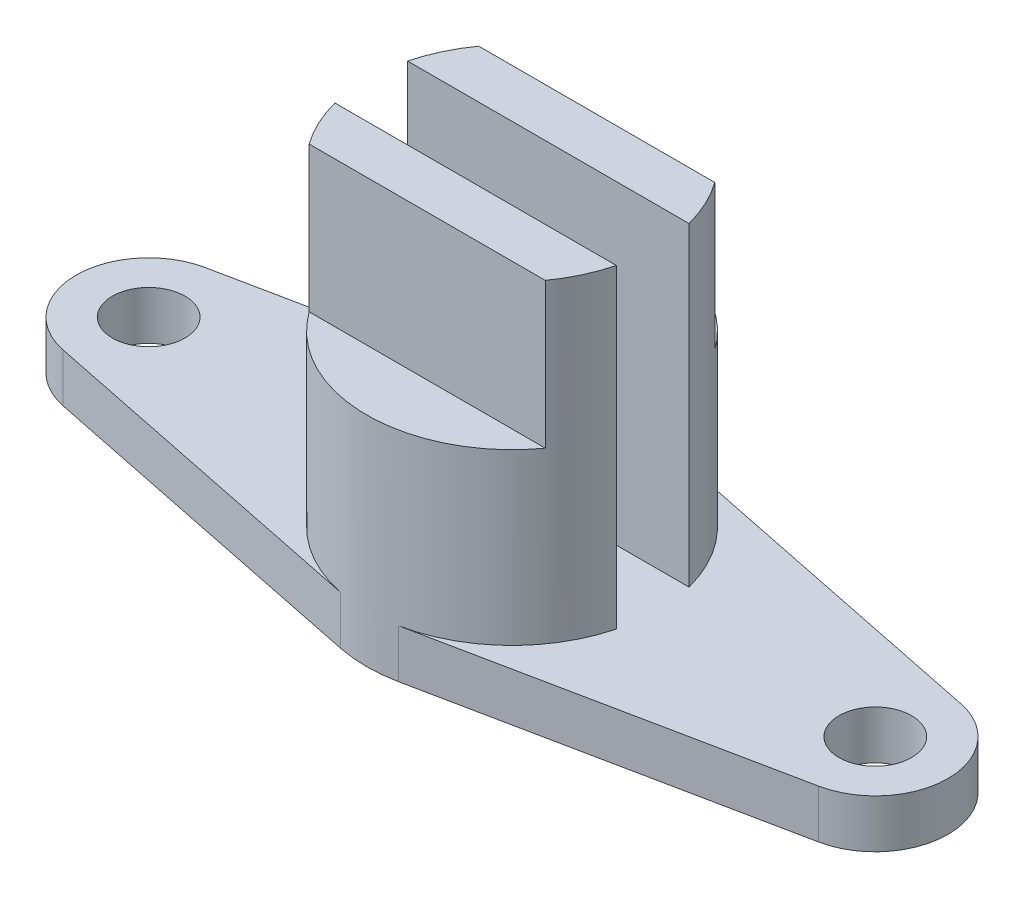
ISO-10303-21;
HEADER;
FILE_DESCRIPTION(('STEP AP214'),'2;1');
FILE_NAME('part.step','',(''),(''),'','','');
FILE_SCHEMA(('AUTOMOTIVE_DESIGN { 1 0 10303 214 1 1 1 1 }'));
ENDSEC;
DATA;
#1=APPLICATION_CONTEXT('core data for automotive mechanical design processes');
#2=APPLICATION_PROTOCOL_DEFINITION('international standard','automotive_design',2000,#1);
#3=PRODUCT_CONTEXT('',#1,'mechanical');
#4=PRODUCT('Part','Part','',(#3));
#5=PRODUCT_RELATED_PRODUCT_CATEGORY('part','',(#4));
#6=PRODUCT_DEFINITION_FORMATION('','',#4);
#7=PRODUCT_DEFINITION_CONTEXT('part definition',#1,'design');
#8=PRODUCT_DEFINITION('design','',#6,#7);
#9=PRODUCT_DEFINITION_SHAPE('','',#8);
#10=(LENGTH_UNIT() NAMED_UNIT(*) SI_UNIT(.MILLI.,.METRE.));
#11=(NAMED_UNIT(*) PLANE_ANGLE_UNIT() SI_UNIT($,.RADIAN.));
#12=(NAMED_UNIT(*) SI_UNIT($,.STERADIAN.) SOLID_ANGLE_UNIT());
#13=UNCERTAINTY_MEASURE_WITH_UNIT(LENGTH_MEASURE(1.E-05),#10,'distance_accuracy_value','');
#14=(GEOMETRIC_REPRESENTATION_CONTEXT(3) GLOBAL_UNCERTAINTY_ASSIGNED_CONTEXT((#13)) GLOBAL_UNIT_ASSIGNED_CONTEXT((#10,
#11,#12)) REPRESENTATION_CONTEXT('',''));
#15=CARTESIAN_POINT('',(0.,0.,0.));
#16=DIRECTION('',(0.,0.,1.));
#17=DIRECTION('',(1.,0.,0.));
#18=AXIS2_PLACEMENT_3D('',#15,#16,#17);
#19=CARTESIAN_POINT('',(0.,10.,0.));
#20=DIRECTION('',(0.,-1.,0.));
#21=DIRECTION('',(0.,0.,-1.));
#22=AXIS2_PLACEMENT_3D('',#19,#20,#21);
#23=CYLINDRICAL_SURFACE('',#22,30.);
#24=DIRECTION('',(0.,-1.,0.));
#25=VECTOR('',#24,1.);
#26=CARTESIAN_POINT('',(24.3669858620224,10.,-17.5));
#27=LINE('',#26,#25);
#28=CARTESIAN_POINT('',(24.3669858620224,75.,-17.5));
#29=VERTEX_POINT('',#28);
#30=CARTESIAN_POINT('',(24.3669858620224,45.,-17.5));
#31=VERTEX_POINT('',#30);
#32=EDGE_CURVE('E159',#29,#31,#27,.T.);
#33=ORIENTED_EDGE('',*,*,#32,.F.);
#34=CARTESIAN_POINT('',(0.,75.,0.));
#35=DIRECTION('',(0.,1.,0.));
#36=DIRECTION('',(0.,0.,1.));
#37=AXIS2_PLACEMENT_3D('',#34,#35,#36);
#38=CIRCLE('',#37,30.);
#39=CARTESIAN_POINT('',(29.0473750965556,75.,-7.5));
#40=VERTEX_POINT('',#39);
#41=EDGE_CURVE('E207',#40,#29,#38,.T.);
#42=ORIENTED_EDGE('',*,*,#41,.F.);
#43=DIRECTION('',(0.,-1.,0.));
#44=VECTOR('',#43,1.);
#45=CARTESIAN_POINT('',(29.0473750965556,10.,-7.49999999999999));
#46=LINE('',#45,#44);
#47=CARTESIAN_POINT('',(29.0473750965556,9.99999999999999,-7.49999999999999));
#48=VERTEX_POINT('',#47);
#49=EDGE_CURVE('E189',#40,#48,#46,.T.);
#50=ORIENTED_EDGE('',*,*,#49,.T.);
#51=CARTESIAN_POINT('',(0.,10.,0.));
#52=DIRECTION('',(0.,1.,0.));
#53=DIRECTION('',(0.,0.,1.));
#54=AXIS2_PLACEMENT_3D('',#51,#52,#53);
#55=CIRCLE('',#54,30.);
#56=CARTESIAN_POINT('',(6.,10.,-29.3938769133981));
#57=VERTEX_POINT('',#56);
#58=EDGE_CURVE('E201',#48,#57,#55,.T.);
#59=ORIENTED_EDGE('',*,*,#58,.T.);
#60=DIRECTION('',(0.,-1.,0.));
#61=VECTOR('',#60,1.);
#62=CARTESIAN_POINT('',(6.,10.,-29.3938769133981));
#63=LINE('',#62,#61);
#64=CARTESIAN_POINT('',(6.,0.,-29.3938769133981));
#65=VERTEX_POINT('',#64);
#66=EDGE_CURVE('E299',#57,#65,#63,.T.);
#67=ORIENTED_EDGE('',*,*,#66,.T.);
#68=CARTESIAN_POINT('',(0.,0.,0.));
#69=DIRECTION('',(0.,1.,0.));
#70=DIRECTION('',(0.,0.,1.));
#71=AXIS2_PLACEMENT_3D('',#68,#69,#70);
#72=CIRCLE('',#71,30.);
#73=CARTESIAN_POINT('',(-6.,0.,-29.3938769133981));
#74=VERTEX_POINT('',#73);
#75=EDGE_CURVE('E259',#65,#74,#72,.T.);
#76=ORIENTED_EDGE('',*,*,#75,.T.);
#77=DIRECTION('',(0.,-1.,0.));
#78=VECTOR('',#77,1.);
#79=CARTESIAN_POINT('',(-6.,10.,-29.3938769133981));
#80=LINE('',#79,#78);
#81=CARTESIAN_POINT('',(-6.,10.,-29.3938769133981));
#82=VERTEX_POINT('',#81);
#83=EDGE_CURVE('E295',#82,#74,#80,.T.);
#84=ORIENTED_EDGE('',*,*,#83,.F.);
#85=CARTESIAN_POINT('',(-29.0473750965556,9.99999999999999,-7.49999999999999));
#86=VERTEX_POINT('',#85);
#87=EDGE_CURVE('E213',#82,#86,#55,.T.);
#88=ORIENTED_EDGE('',*,*,#87,.T.);
#89=DIRECTION('',(0.,-1.,0.));
#90=VECTOR('',#89,1.);
#91=CARTESIAN_POINT('',(-29.0473750965556,10.,-7.49999999999999));
#92=LINE('',#91,#90);
#93=CARTESIAN_POINT('',(-29.0473750965556,75.,-7.5));
#94=VERTEX_POINT('',#93);
#95=EDGE_CURVE('E183',#86,#94,#92,.F.);
#96=ORIENTED_EDGE('',*,*,#95,.T.);
#97=CARTESIAN_POINT('',(-24.3669858620224,75.,-17.5));
#98=VERTEX_POINT('',#97);
#99=EDGE_CURVE('E164',#98,#94,#38,.T.);
#100=ORIENTED_EDGE('',*,*,#99,.F.);
#101=DIRECTION('',(0.,-1.,0.));
#102=VECTOR('',#101,1.);
#103=CARTESIAN_POINT('',(-24.3669858620224,10.,-17.5));
#104=LINE('',#103,#102);
#105=CARTESIAN_POINT('',(-24.3669858620224,45.,-17.5));
#106=VERTEX_POINT('',#105);
#107=EDGE_CURVE('E55',#106,#98,#104,.F.);
#108=ORIENTED_EDGE('',*,*,#107,.F.);
#109=CARTESIAN_POINT('',(0.,45.,0.));
#110=DIRECTION('',(0.,1.,0.));
#111=DIRECTION('',(0.,0.,1.));
#112=AXIS2_PLACEMENT_3D('',#109,#110,#111);
#113=CIRCLE('',#112,30.);
#114=EDGE_CURVE('E11',#31,#106,#113,.T.);
#115=ORIENTED_EDGE('',*,*,#114,.F.);
#116=EDGE_LOOP('',(#33,#42,#50,#59,#67,#76,#84,#88,#96,#100,#108,#115));
#117=FACE_BOUND('',#116,.T.);
#118=ADVANCED_FACE('F39',(#117),#23,.T.);
#119=CARTESIAN_POINT('',(0.,75.,0.));
#120=DIRECTION('',(0.,1.,0.));
#121=DIRECTION('',(0.,0.,1.));
#122=AXIS2_PLACEMENT_3D('',#119,#120,#121);
#123=PLANE('',#122);
#124=ORIENTED_EDGE('',*,*,#41,.T.);
#125=DIRECTION('',(-1.,0.,0.));
#126=VECTOR('',#125,1.);
#127=CARTESIAN_POINT('',(0.,75.,-17.5));
#128=LINE('',#127,#126);
#129=EDGE_CURVE('E48',#29,#98,#128,.T.);
#130=ORIENTED_EDGE('',*,*,#129,.T.);
#131=ORIENTED_EDGE('',*,*,#99,.T.);
#132=DIRECTION('',(-1.,0.,0.));
#133=VECTOR('',#132,1.);
#134=CARTESIAN_POINT('',(0.,75.,-7.5));
#135=LINE('',#134,#133);
#136=EDGE_CURVE('E307',#40,#94,#135,.T.);
#137=ORIENTED_EDGE('',*,*,#136,.F.);
#138=EDGE_LOOP('',(#124,#130,#131,#137));
#139=FACE_BOUND('',#138,.T.);
#140=ADVANCED_FACE('F324',(#139),#123,.T.);
#141=CARTESIAN_POINT('',(24.3669858620224,75.,17.5));
#142=VERTEX_POINT('',#141);
#143=CARTESIAN_POINT('',(29.0473750965556,75.,7.5));
#144=VERTEX_POINT('',#143);
#145=EDGE_CURVE('E206',#142,#144,#38,.T.);
#146=ORIENTED_EDGE('',*,*,#145,.F.);
#147=DIRECTION('',(0.,-1.,0.));
#148=VECTOR('',#147,1.);
#149=CARTESIAN_POINT('',(24.3669858620224,10.,17.5));
#150=LINE('',#149,#148);
#151=CARTESIAN_POINT('',(24.3669858620224,45.,17.5));
#152=VERTEX_POINT('',#151);
#153=EDGE_CURVE('E63',#142,#152,#150,.T.);
#154=ORIENTED_EDGE('',*,*,#153,.T.);
#155=CARTESIAN_POINT('',(0.,45.,0.));
#156=DIRECTION('',(0.,-1.,0.));
#157=DIRECTION('',(0.,0.,-1.));
#158=AXIS2_PLACEMENT_3D('',#155,#156,#157);
#159=CIRCLE('',#158,30.);
#160=CARTESIAN_POINT('',(-24.3669858620224,45.,17.5));
#161=VERTEX_POINT('',#160);
#162=EDGE_CURVE('E318',#152,#161,#159,.T.);
#163=ORIENTED_EDGE('',*,*,#162,.T.);
#164=DIRECTION('',(0.,-1.,0.));
#165=VECTOR('',#164,1.);
#166=CARTESIAN_POINT('',(-24.3669858620224,10.,17.5));
#167=LINE('',#166,#165);
#168=CARTESIAN_POINT('',(-24.3669858620224,75.,17.5));
#169=VERTEX_POINT('',#168);
#170=EDGE_CURVE('E173',#161,#169,#167,.F.);
#171=ORIENTED_EDGE('',*,*,#170,.T.);
#172=CARTESIAN_POINT('',(-29.0473750965556,75.,7.5));
#173=VERTEX_POINT('',#172);
#174=EDGE_CURVE('E202',#173,#169,#38,.T.);
#175=ORIENTED_EDGE('',*,*,#174,.F.);
#176=DIRECTION('',(0.,-1.,0.));
#177=VECTOR('',#176,1.);
#178=CARTESIAN_POINT('',(-29.0473750965556,10.,7.49999999999999));
#179=LINE('',#178,#177);
#180=CARTESIAN_POINT('',(-29.0473750965556,9.99999999999999,7.49999999999999));
#181=VERTEX_POINT('',#180);
#182=EDGE_CURVE('E197',#173,#181,#179,.T.);
#183=ORIENTED_EDGE('',*,*,#182,.T.);
#184=CARTESIAN_POINT('',(-5.99999999999999,10.,29.3938769133981));
#185=VERTEX_POINT('',#184);
#186=EDGE_CURVE('E212',#181,#185,#55,.T.);
#187=ORIENTED_EDGE('',*,*,#186,.T.);
#188=DIRECTION('',(0.,-1.,0.));
#189=VECTOR('',#188,1.);
#190=CARTESIAN_POINT('',(-5.99999999999999,10.,29.3938769133981));
#191=LINE('',#190,#189);
#192=CARTESIAN_POINT('',(-5.99999999999999,0.,29.3938769133981));
#193=VERTEX_POINT('',#192);
#194=EDGE_CURVE('E283',#185,#193,#191,.T.);
#195=ORIENTED_EDGE('',*,*,#194,.T.);
#196=CARTESIAN_POINT('',(0.,0.,0.));
#197=DIRECTION('',(0.,1.,0.));
#198=DIRECTION('',(0.,0.,1.));
#199=AXIS2_PLACEMENT_3D('',#196,#197,#198);
#200=CIRCLE('',#199,30.);
#201=CARTESIAN_POINT('',(6.,0.,29.3938769133981));
#202=VERTEX_POINT('',#201);
#203=EDGE_CURVE('E271',#193,#202,#200,.T.);
#204=ORIENTED_EDGE('',*,*,#203,.T.);
#205=DIRECTION('',(0.,-1.,0.));
#206=VECTOR('',#205,1.);
#207=CARTESIAN_POINT('',(6.,10.,29.3938769133981));
#208=LINE('',#207,#206);
#209=CARTESIAN_POINT('',(6.,10.,29.3938769133981));
#210=VERTEX_POINT('',#209);
#211=EDGE_CURVE('E279',#210,#202,#208,.T.);
#212=ORIENTED_EDGE('',*,*,#211,.F.);
#213=CARTESIAN_POINT('',(29.0473750965556,9.99999999999999,7.49999999999999));
#214=VERTEX_POINT('',#213);
#215=EDGE_CURVE('E208',#210,#214,#55,.T.);
#216=ORIENTED_EDGE('',*,*,#215,.T.);
#217=DIRECTION('',(0.,-1.,0.));
#218=VECTOR('',#217,1.);
#219=CARTESIAN_POINT('',(29.0473750965556,10.,7.49999999999999));
#220=LINE('',#219,#218);
#221=EDGE_CURVE('E193',#214,#144,#220,.F.);
#222=ORIENTED_EDGE('',*,*,#221,.T.);
#223=EDGE_LOOP('',(#146,#154,#163,#171,#175,#183,#187,#195,#204,#212,#216,#222));
#224=FACE_BOUND('',#223,.T.);
#225=ADVANCED_FACE('F339',(#224),#23,.T.);
#226=DIRECTION('',(-1.,0.,0.));
#227=VECTOR('',#226,1.);
#228=CARTESIAN_POINT('',(0.,75.,17.5));
#229=LINE('',#228,#227);
#230=EDGE_CURVE('E315',#142,#169,#229,.T.);
#231=ORIENTED_EDGE('',*,*,#230,.F.);
#232=ORIENTED_EDGE('',*,*,#145,.T.);
#233=DIRECTION('',(1.,0.,0.));
#234=VECTOR('',#233,1.);
#235=CARTESIAN_POINT('',(0.,75.,7.5));
#236=LINE('',#235,#234);
#237=EDGE_CURVE('E311',#173,#144,#236,.T.);
#238=ORIENTED_EDGE('',*,*,#237,.F.);
#239=ORIENTED_EDGE('',*,*,#174,.T.);
#240=EDGE_LOOP('',(#231,#232,#238,#239));
#241=FACE_BOUND('',#240,.T.);
#242=ADVANCED_FACE('F334',(#241),#123,.T.);
#243=CARTESIAN_POINT('',(75.,10.,0.));
#244=DIRECTION('',(0.,-1.,0.));
#245=DIRECTION('',(0.,0.,-1.));
#246=AXIS2_PLACEMENT_3D('',#243,#244,#245);
#247=PLANE('',#246);
#248=CARTESIAN_POINT('',(75.,10.,0.));
#249=DIRECTION('',(0.,1.,0.));
#250=DIRECTION('',(0.,0.,1.));
#251=AXIS2_PLACEMENT_3D('',#248,#249,#250);
#252=CIRCLE('',#251,7.5);
#253=CARTESIAN_POINT('',(75.,10.,7.5));
#254=VERTEX_POINT('',#253);
#255=EDGE_CURVE('E214',#254,#254,#252,.T.);
#256=ORIENTED_EDGE('',*,*,#255,.F.);
#257=EDGE_LOOP('',(#256));
#258=FACE_BOUND('',#257,.T.);
#259=CARTESIAN_POINT('',(-75.,10.,0.));
#260=DIRECTION('',(0.,1.,0.));
#261=DIRECTION('',(0.,0.,1.));
#262=AXIS2_PLACEMENT_3D('',#259,#260,#261);
#263=CIRCLE('',#262,7.5);
#264=CARTESIAN_POINT('',(-75.,10.,7.50000000000002));
#265=VERTEX_POINT('',#264);
#266=EDGE_CURVE('E223',#265,#265,#263,.T.);
#267=ORIENTED_EDGE('',*,*,#266,.F.);
#268=EDGE_LOOP('',(#267));
#269=FACE_BOUND('',#268,.T.);
#270=CARTESIAN_POINT('',(-75.,10.,0.));
#271=DIRECTION('',(0.,1.,0.));
#272=DIRECTION('',(0.,0.,1.));
#273=AXIS2_PLACEMENT_3D('',#270,#271,#272);
#274=CIRCLE('',#273,15.);
#275=CARTESIAN_POINT('',(-78.,10.,-14.696938456699));
#276=VERTEX_POINT('',#275);
#277=CARTESIAN_POINT('',(-78.,10.,14.6969384566991));
#278=VERTEX_POINT('',#277);
#279=EDGE_CURVE('E242',#276,#278,#274,.T.);
#280=ORIENTED_EDGE('',*,*,#279,.T.);
#281=DIRECTION('',(0.979795897113271,0.,0.2));
#282=VECTOR('',#281,1.);
#283=CARTESIAN_POINT('',(-5.99999999999999,10.,29.3938769133981));
#284=LINE('',#283,#282);
#285=EDGE_CURVE('E245',#278,#185,#284,.T.);
#286=ORIENTED_EDGE('',*,*,#285,.T.);
#287=ORIENTED_EDGE('',*,*,#186,.F.);
#288=DIRECTION('',(1.,0.,0.));
#289=VECTOR('',#288,1.);
#290=CARTESIAN_POINT('',(-90.,9.99999999999999,7.49999999999999));
#291=LINE('',#290,#289);
#292=EDGE_CURVE('E179',#181,#214,#291,.T.);
#293=ORIENTED_EDGE('',*,*,#292,.T.);
#294=ORIENTED_EDGE('',*,*,#215,.F.);
#295=DIRECTION('',(0.979795897113271,0.,-0.2));
#296=VECTOR('',#295,1.);
#297=CARTESIAN_POINT('',(6.,10.,29.3938769133981));
#298=LINE('',#297,#296);
#299=CARTESIAN_POINT('',(78.,10.,14.6969384566991));
#300=VERTEX_POINT('',#299);
#301=EDGE_CURVE('E249',#210,#300,#298,.T.);
#302=ORIENTED_EDGE('',*,*,#301,.T.);
#303=CARTESIAN_POINT('',(75.,10.,0.));
#304=DIRECTION('',(0.,1.,0.));
#305=DIRECTION('',(0.,0.,-1.));
#306=AXIS2_PLACEMENT_3D('',#303,#304,#305);
#307=CIRCLE('',#306,15.);
#308=CARTESIAN_POINT('',(78.,10.,-14.6969384566991));
#309=VERTEX_POINT('',#308);
#310=EDGE_CURVE('E231',#300,#309,#307,.T.);
#311=ORIENTED_EDGE('',*,*,#310,.T.);
#312=DIRECTION('',(-0.979795897113271,0.,-0.2));
#313=VECTOR('',#312,1.);
#314=CARTESIAN_POINT('',(6.,10.,-29.3938769133981));
#315=LINE('',#314,#313);
#316=EDGE_CURVE('E234',#309,#57,#315,.T.);
#317=ORIENTED_EDGE('',*,*,#316,.T.);
#318=ORIENTED_EDGE('',*,*,#58,.F.);
#319=DIRECTION('',(1.,0.,0.));
#320=VECTOR('',#319,1.);
#321=CARTESIAN_POINT('',(-90.,9.99999999999999,-7.49999999999999));
#322=LINE('',#321,#320);
#323=EDGE_CURVE('E180',#86,#48,#322,.T.);
#324=ORIENTED_EDGE('',*,*,#323,.F.);
#325=ORIENTED_EDGE('',*,*,#87,.F.);
#326=DIRECTION('',(-0.979795897113271,0.,0.2));
#327=VECTOR('',#326,1.);
#328=CARTESIAN_POINT('',(-6.,10.,-29.3938769133981));
#329=LINE('',#328,#327);
#330=EDGE_CURVE('E239',#82,#276,#329,.T.);
#331=ORIENTED_EDGE('',*,*,#330,.T.);
#332=EDGE_LOOP('',(#280,#286,#287,#293,#294,#302,#311,#317,#318,#324,#325,#331));
#333=FACE_BOUND('',#332,.T.);
#334=ADVANCED_FACE('F343',(#258,#269,#333),#247,.F.);
#335=CARTESIAN_POINT('',(75.,0.,0.));
#336=DIRECTION('',(0.,-1.,0.));
#337=DIRECTION('',(0.,0.,-1.));
#338=AXIS2_PLACEMENT_3D('',#335,#336,#337);
#339=PLANE('',#338);
#340=CARTESIAN_POINT('',(-75.,0.,0.));
#341=DIRECTION('',(0.,1.,0.));
#342=DIRECTION('',(0.,0.,1.));
#343=AXIS2_PLACEMENT_3D('',#340,#341,#342);
#344=CIRCLE('',#343,7.5);
#345=CARTESIAN_POINT('',(-75.,0.,7.50000000000002));
#346=VERTEX_POINT('',#345);
#347=EDGE_CURVE('E218',#346,#346,#344,.T.);
#348=ORIENTED_EDGE('',*,*,#347,.T.);
#349=EDGE_LOOP('',(#348));
#350=FACE_BOUND('',#349,.T.);
#351=CARTESIAN_POINT('',(75.,0.,0.));
#352=DIRECTION('',(0.,1.,0.));
#353=DIRECTION('',(0.,0.,-1.));
#354=AXIS2_PLACEMENT_3D('',#351,#352,#353);
#355=CIRCLE('',#354,15.);
#356=CARTESIAN_POINT('',(78.,0.,14.6969384566991));
#357=VERTEX_POINT('',#356);
#358=CARTESIAN_POINT('',(78.,0.,-14.6969384566991));
#359=VERTEX_POINT('',#358);
#360=EDGE_CURVE('E227',#357,#359,#355,.T.);
#361=ORIENTED_EDGE('',*,*,#360,.F.);
#362=DIRECTION('',(0.979795897113271,0.,-0.2));
#363=VECTOR('',#362,1.);
#364=CARTESIAN_POINT('',(6.,0.,29.3938769133981));
#365=LINE('',#364,#363);
#366=EDGE_CURVE('E235',#202,#357,#365,.T.);
#367=ORIENTED_EDGE('',*,*,#366,.F.);
#368=ORIENTED_EDGE('',*,*,#203,.F.);
#369=DIRECTION('',(0.979795897113271,0.,0.2));
#370=VECTOR('',#369,1.);
#371=CARTESIAN_POINT('',(-5.99999999999999,0.,29.3938769133981));
#372=LINE('',#371,#370);
#373=CARTESIAN_POINT('',(-78.,0.,14.6969384566991));
#374=VERTEX_POINT('',#373);
#375=EDGE_CURVE('E268',#374,#193,#372,.T.);
#376=ORIENTED_EDGE('',*,*,#375,.F.);
#377=CARTESIAN_POINT('',(-75.,0.,0.));
#378=DIRECTION('',(0.,1.,0.));
#379=DIRECTION('',(0.,0.,1.));
#380=AXIS2_PLACEMENT_3D('',#377,#378,#379);
#381=CIRCLE('',#380,15.);
#382=CARTESIAN_POINT('',(-78.,0.,-14.696938456699));
#383=VERTEX_POINT('',#382);
#384=EDGE_CURVE('E265',#383,#374,#381,.T.);
#385=ORIENTED_EDGE('',*,*,#384,.F.);
#386=DIRECTION('',(-0.979795897113271,0.,0.2));
#387=VECTOR('',#386,1.);
#388=CARTESIAN_POINT('',(-6.,0.,-29.3938769133981));
#389=LINE('',#388,#387);
#390=EDGE_CURVE('E262',#74,#383,#389,.T.);
#391=ORIENTED_EDGE('',*,*,#390,.F.);
#392=ORIENTED_EDGE('',*,*,#75,.F.);
#393=DIRECTION('',(-0.979795897113271,0.,-0.2));
#394=VECTOR('',#393,1.);
#395=CARTESIAN_POINT('',(6.,0.,-29.3938769133981));
#396=LINE('',#395,#394);
#397=EDGE_CURVE('E256',#359,#65,#396,.T.);
#398=ORIENTED_EDGE('',*,*,#397,.F.);
#399=EDGE_LOOP('',(#361,#367,#368,#376,#385,#391,#392,#398));
#400=FACE_BOUND('',#399,.T.);
#401=CARTESIAN_POINT('',(75.,0.,0.));
#402=DIRECTION('',(0.,1.,0.));
#403=DIRECTION('',(0.,0.,1.));
#404=AXIS2_PLACEMENT_3D('',#401,#402,#403);
#405=CIRCLE('',#404,7.5);
#406=CARTESIAN_POINT('',(75.,0.,7.5));
#407=VERTEX_POINT('',#406);
#408=EDGE_CURVE('E219',#407,#407,#405,.T.);
#409=ORIENTED_EDGE('',*,*,#408,.T.);
#410=EDGE_LOOP('',(#409));
#411=FACE_BOUND('',#410,.T.);
#412=ADVANCED_FACE('F375',(#350,#400,#411),#339,.T.);
#413=CARTESIAN_POINT('',(75.,10.,0.));
#414=DIRECTION('',(0.,-1.,0.));
#415=DIRECTION('',(0.,0.,-1.));
#416=AXIS2_PLACEMENT_3D('',#413,#414,#415);
#417=CYLINDRICAL_SURFACE('',#416,15.);
#418=ORIENTED_EDGE('',*,*,#360,.T.);
#419=DIRECTION('',(0.,-1.,0.));
#420=VECTOR('',#419,1.);
#421=CARTESIAN_POINT('',(78.,10.,-14.6969384566991));
#422=LINE('',#421,#420);
#423=EDGE_CURVE('E303',#309,#359,#422,.T.);
#424=ORIENTED_EDGE('',*,*,#423,.F.);
#425=ORIENTED_EDGE('',*,*,#310,.F.);
#426=DIRECTION('',(0.,-1.,0.));
#427=VECTOR('',#426,1.);
#428=CARTESIAN_POINT('',(78.,10.,14.6969384566991));
#429=LINE('',#428,#427);
#430=EDGE_CURVE('E252',#300,#357,#429,.T.);
#431=ORIENTED_EDGE('',*,*,#430,.T.);
#432=EDGE_LOOP('',(#418,#424,#425,#431));
#433=FACE_BOUND('',#432,.T.);
#434=ADVANCED_FACE('F41',(#433),#417,.T.);
#435=CARTESIAN_POINT('',(6.,10.,-29.3938769133981));
#436=DIRECTION('',(-0.2,0.,0.979795897113271));
#437=DIRECTION('',(0.979795897113271,0.,0.2));
#438=AXIS2_PLACEMENT_3D('',#435,#436,#437);
#439=PLANE('',#438);
#440=ORIENTED_EDGE('',*,*,#397,.T.);
#441=ORIENTED_EDGE('',*,*,#66,.F.);
#442=ORIENTED_EDGE('',*,*,#316,.F.);
#443=ORIENTED_EDGE('',*,*,#423,.T.);
#444=EDGE_LOOP('',(#440,#441,#442,#443));
#445=FACE_BOUND('',#444,.T.);
#446=ADVANCED_FACE('F412',(#445),#439,.F.);
#447=CARTESIAN_POINT('',(-6.,10.,-29.3938769133981));
#448=DIRECTION('',(0.2,0.,0.979795897113271));
#449=DIRECTION('',(0.979795897113271,0.,-0.2));
#450=AXIS2_PLACEMENT_3D('',#447,#448,#449);
#451=PLANE('',#450);
#452=ORIENTED_EDGE('',*,*,#390,.T.);
#453=DIRECTION('',(0.,-1.,0.));
#454=VECTOR('',#453,1.);
#455=CARTESIAN_POINT('',(-78.,10.,-14.696938456699));
#456=LINE('',#455,#454);
#457=EDGE_CURVE('E291',#276,#383,#456,.T.);
#458=ORIENTED_EDGE('',*,*,#457,.F.);
#459=ORIENTED_EDGE('',*,*,#330,.F.);
#460=ORIENTED_EDGE('',*,*,#83,.T.);
#461=EDGE_LOOP('',(#452,#458,#459,#460));
#462=FACE_BOUND('',#461,.T.);
#463=ADVANCED_FACE('F424',(#462),#451,.F.);
#464=CARTESIAN_POINT('',(-75.,10.,0.));
#465=DIRECTION('',(0.,-1.,0.));
#466=DIRECTION('',(0.,0.,-1.));
#467=AXIS2_PLACEMENT_3D('',#464,#465,#466);
#468=CYLINDRICAL_SURFACE('',#467,15.);
#469=ORIENTED_EDGE('',*,*,#384,.T.);
#470=DIRECTION('',(0.,-1.,0.));
#471=VECTOR('',#470,1.);
#472=CARTESIAN_POINT('',(-78.,10.,14.6969384566991));
#473=LINE('',#472,#471);
#474=EDGE_CURVE('E287',#278,#374,#473,.T.);
#475=ORIENTED_EDGE('',*,*,#474,.F.);
#476=ORIENTED_EDGE('',*,*,#279,.F.);
#477=ORIENTED_EDGE('',*,*,#457,.T.);
#478=EDGE_LOOP('',(#469,#475,#476,#477));
#479=FACE_BOUND('',#478,.T.);
#480=ADVANCED_FACE('F397',(#479),#468,.T.);
#481=CARTESIAN_POINT('',(-5.99999999999999,10.,29.3938769133981));
#482=DIRECTION('',(0.2,0.,-0.979795897113271));
#483=DIRECTION('',(-0.979795897113271,0.,-0.2));
#484=AXIS2_PLACEMENT_3D('',#481,#482,#483);
#485=PLANE('',#484);
#486=ORIENTED_EDGE('',*,*,#375,.T.);
#487=ORIENTED_EDGE('',*,*,#194,.F.);
#488=ORIENTED_EDGE('',*,*,#285,.F.);
#489=ORIENTED_EDGE('',*,*,#474,.T.);
#490=EDGE_LOOP('',(#486,#487,#488,#489));
#491=FACE_BOUND('',#490,.T.);
#492=ADVANCED_FACE('F392',(#491),#485,.F.);
#493=CARTESIAN_POINT('',(6.,10.,29.3938769133981));
#494=DIRECTION('',(-0.2,0.,-0.979795897113271));
#495=DIRECTION('',(-0.979795897113271,0.,0.2));
#496=AXIS2_PLACEMENT_3D('',#493,#494,#495);
#497=PLANE('',#496);
#498=ORIENTED_EDGE('',*,*,#366,.T.);
#499=ORIENTED_EDGE('',*,*,#430,.F.);
#500=ORIENTED_EDGE('',*,*,#301,.F.);
#501=ORIENTED_EDGE('',*,*,#211,.T.);
#502=EDGE_LOOP('',(#498,#499,#500,#501));
#503=FACE_BOUND('',#502,.T.);
#504=ADVANCED_FACE('F386',(#503),#497,.F.);
#505=CARTESIAN_POINT('',(-75.,10.,0.));
#506=DIRECTION('',(0.,-1.,0.));
#507=DIRECTION('',(0.,0.,-1.));
#508=AXIS2_PLACEMENT_3D('',#505,#506,#507);
#509=CYLINDRICAL_SURFACE('',#508,7.5);
#510=ORIENTED_EDGE('',*,*,#266,.T.);
#511=EDGE_LOOP('',(#510));
#512=FACE_BOUND('',#511,.T.);
#513=ORIENTED_EDGE('',*,*,#347,.F.);
#514=EDGE_LOOP('',(#513));
#515=FACE_BOUND('',#514,.T.);
#516=ADVANCED_FACE('F383',(#512,#515),#509,.F.);
#517=CARTESIAN_POINT('',(75.,10.,0.));
#518=DIRECTION('',(0.,-1.,0.));
#519=DIRECTION('',(0.,0.,-1.));
#520=AXIS2_PLACEMENT_3D('',#517,#518,#519);
#521=CYLINDRICAL_SURFACE('',#520,7.5);
#522=ORIENTED_EDGE('',*,*,#255,.T.);
#523=EDGE_LOOP('',(#522));
#524=FACE_BOUND('',#523,.T.);
#525=ORIENTED_EDGE('',*,*,#408,.F.);
#526=EDGE_LOOP('',(#525));
#527=FACE_BOUND('',#526,.T.);
#528=ADVANCED_FACE('F380',(#524,#527),#521,.F.);
#529=CARTESIAN_POINT('',(-90.,75.,7.5));
#530=DIRECTION('',(0.,0.,1.));
#531=DIRECTION('',(0.,-1.,0.));
#532=AXIS2_PLACEMENT_3D('',#529,#530,#531);
#533=PLANE('',#532);
#534=ORIENTED_EDGE('',*,*,#237,.T.);
#535=ORIENTED_EDGE('',*,*,#221,.F.);
#536=ORIENTED_EDGE('',*,*,#292,.F.);
#537=ORIENTED_EDGE('',*,*,#182,.F.);
#538=EDGE_LOOP('',(#534,#535,#536,#537));
#539=FACE_BOUND('',#538,.T.);
#540=ADVANCED_FACE('F338',(#539),#533,.F.);
#541=CARTESIAN_POINT('',(-90.,75.,-7.5));
#542=DIRECTION('',(0.,0.,-1.));
#543=DIRECTION('',(0.,1.,0.));
#544=AXIS2_PLACEMENT_3D('',#541,#542,#543);
#545=PLANE('',#544);
#546=ORIENTED_EDGE('',*,*,#136,.T.);
#547=ORIENTED_EDGE('',*,*,#95,.F.);
#548=ORIENTED_EDGE('',*,*,#323,.T.);
#549=ORIENTED_EDGE('',*,*,#49,.F.);
#550=EDGE_LOOP('',(#546,#547,#548,#549));
#551=FACE_BOUND('',#550,.T.);
#552=ADVANCED_FACE('F351',(#551),#545,.F.);
#553=CARTESIAN_POINT('',(-90.,45.,30.));
#554=DIRECTION('',(0.,-1.,0.));
#555=DIRECTION('',(0.,0.,-1.));
#556=AXIS2_PLACEMENT_3D('',#553,#554,#555);
#557=PLANE('',#556);
#558=DIRECTION('',(1.,0.,0.));
#559=VECTOR('',#558,1.);
#560=CARTESIAN_POINT('',(-90.,45.,17.5));
#561=LINE('',#560,#559);
#562=EDGE_CURVE('E168',#161,#152,#561,.T.);
#563=ORIENTED_EDGE('',*,*,#562,.F.);
#564=ORIENTED_EDGE('',*,*,#162,.F.);
#565=EDGE_LOOP('',(#563,#564));
#566=FACE_BOUND('',#565,.T.);
#567=ADVANCED_FACE('F349',(#566),#557,.F.);
#568=CARTESIAN_POINT('',(-90.,75.,17.5));
#569=DIRECTION('',(0.,0.,-1.));
#570=DIRECTION('',(0.,1.,0.));
#571=AXIS2_PLACEMENT_3D('',#568,#569,#570);
#572=PLANE('',#571);
#573=ORIENTED_EDGE('',*,*,#230,.T.);
#574=ORIENTED_EDGE('',*,*,#170,.F.);
#575=ORIENTED_EDGE('',*,*,#562,.T.);
#576=ORIENTED_EDGE('',*,*,#153,.F.);
#577=EDGE_LOOP('',(#573,#574,#575,#576));
#578=FACE_BOUND('',#577,.T.);
#579=ADVANCED_FACE('F347',(#578),#572,.F.);
#580=CARTESIAN_POINT('',(-90.,45.,-30.));
#581=DIRECTION('',(0.,1.,0.));
#582=DIRECTION('',(0.,0.,1.));
#583=AXIS2_PLACEMENT_3D('',#580,#581,#582);
#584=PLANE('',#583);
#585=DIRECTION('',(1.,0.,0.));
#586=VECTOR('',#585,1.);
#587=CARTESIAN_POINT('',(-90.,45.,-17.5));
#588=LINE('',#587,#586);
#589=EDGE_CURVE('E154',#106,#31,#588,.T.);
#590=ORIENTED_EDGE('',*,*,#589,.T.);
#591=ORIENTED_EDGE('',*,*,#114,.T.);
#592=EDGE_LOOP('',(#590,#591));
#593=FACE_BOUND('',#592,.T.);
#594=ADVANCED_FACE('F153',(#593),#584,.T.);
#595=CARTESIAN_POINT('',(-90.,75.,-17.5));
#596=DIRECTION('',(0.,0.,-1.));
#597=DIRECTION('',(0.,1.,0.));
#598=AXIS2_PLACEMENT_3D('',#595,#596,#597);
#599=PLANE('',#598);
#600=ORIENTED_EDGE('',*,*,#32,.T.);
#601=ORIENTED_EDGE('',*,*,#589,.F.);
#602=ORIENTED_EDGE('',*,*,#107,.T.);
#603=ORIENTED_EDGE('',*,*,#129,.F.);
#604=EDGE_LOOP('',(#600,#601,#602,#603));
#605=FACE_BOUND('',#604,.T.);
#606=ADVANCED_FACE('F158',(#605),#599,.T.);
#607=CLOSED_SHELL('',(#118,#140,#225,#242,#334,#412,#434,#446,#463,#480,#492,#504,#516,#528,
#540,#552,#567,#579,#594,#606));
#608=MANIFOLD_SOLID_BREP('B2',#607);
#609=ADVANCED_BREP_SHAPE_REPRESENTATION('',(#18,#608),#14);
#610=SHAPE_DEFINITION_REPRESENTATION(#9,#609);
ENDSEC;
END-ISO-10303-21;
